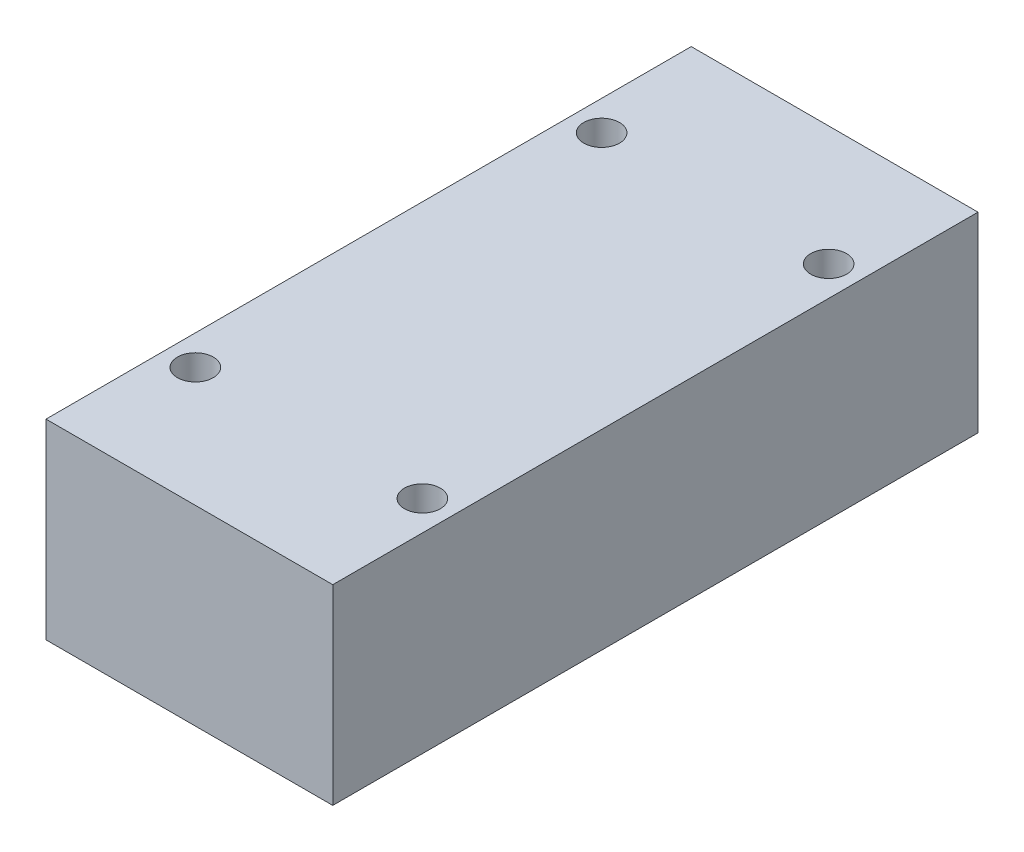
ISO-10303-21;
HEADER;
FILE_DESCRIPTION(('STEP AP214'),'2;1');
FILE_NAME('part.step','',(''),(''),'','','');
FILE_SCHEMA(('AUTOMOTIVE_DESIGN { 1 0 10303 214 1 1 1 1 }'));
ENDSEC;
DATA;
#1=APPLICATION_CONTEXT('core data for automotive mechanical design processes');
#2=APPLICATION_PROTOCOL_DEFINITION('international standard','automotive_design',2000,#1);
#3=PRODUCT_CONTEXT('',#1,'mechanical');
#4=PRODUCT('Part','Part','',(#3));
#5=PRODUCT_RELATED_PRODUCT_CATEGORY('part','',(#4));
#6=PRODUCT_DEFINITION_FORMATION('','',#4);
#7=PRODUCT_DEFINITION_CONTEXT('part definition',#1,'design');
#8=PRODUCT_DEFINITION('design','',#6,#7);
#9=PRODUCT_DEFINITION_SHAPE('','',#8);
#10=(LENGTH_UNIT() NAMED_UNIT(*) SI_UNIT(.MILLI.,.METRE.));
#11=(NAMED_UNIT(*) PLANE_ANGLE_UNIT() SI_UNIT($,.RADIAN.));
#12=(NAMED_UNIT(*) SI_UNIT($,.STERADIAN.) SOLID_ANGLE_UNIT());
#13=UNCERTAINTY_MEASURE_WITH_UNIT(LENGTH_MEASURE(1.E-05),#10,'distance_accuracy_value','');
#14=(GEOMETRIC_REPRESENTATION_CONTEXT(3) GLOBAL_UNCERTAINTY_ASSIGNED_CONTEXT((#13)) GLOBAL_UNIT_ASSIGNED_CONTEXT((#10,
#11,#12)) REPRESENTATION_CONTEXT('',''));
#15=CARTESIAN_POINT('',(0.,0.,0.));
#16=DIRECTION('',(0.,0.,1.));
#17=DIRECTION('',(1.,0.,0.));
#18=AXIS2_PLACEMENT_3D('',#15,#16,#17);
#19=CARTESIAN_POINT('',(-12.,7.99999999999999,27.));
#20=DIRECTION('',(1.,0.,0.));
#21=DIRECTION('',(0.,1.,0.));
#22=AXIS2_PLACEMENT_3D('',#19,#20,#21);
#23=PLANE('',#22);
#24=DIRECTION('',(0.,-1.,0.));
#25=VECTOR('',#24,1.);
#26=CARTESIAN_POINT('',(-12.,7.99999999999999,-27.));
#27=LINE('',#26,#25);
#28=CARTESIAN_POINT('',(-12.,7.99999999999999,-27.));
#29=VERTEX_POINT('',#28);
#30=CARTESIAN_POINT('',(-12.,-8.,-27.));
#31=VERTEX_POINT('',#30);
#32=EDGE_CURVE('E99',#29,#31,#27,.T.);
#33=ORIENTED_EDGE('',*,*,#32,.T.);
#34=DIRECTION('',(0.,0.,-1.));
#35=VECTOR('',#34,1.);
#36=CARTESIAN_POINT('',(-12.,-8.,27.));
#37=LINE('',#36,#35);
#38=CARTESIAN_POINT('',(-12.,-8.,27.));
#39=VERTEX_POINT('',#38);
#40=EDGE_CURVE('E11',#39,#31,#37,.T.);
#41=ORIENTED_EDGE('',*,*,#40,.F.);
#42=DIRECTION('',(0.,-1.,0.));
#43=VECTOR('',#42,1.);
#44=CARTESIAN_POINT('',(-12.,7.99999999999999,27.));
#45=LINE('',#44,#43);
#46=CARTESIAN_POINT('',(-12.,7.99999999999999,27.));
#47=VERTEX_POINT('',#46);
#48=EDGE_CURVE('E87',#47,#39,#45,.T.);
#49=ORIENTED_EDGE('',*,*,#48,.F.);
#50=DIRECTION('',(0.,0.,-1.));
#51=VECTOR('',#50,1.);
#52=CARTESIAN_POINT('',(-12.,7.99999999999999,27.));
#53=LINE('',#52,#51);
#54=EDGE_CURVE('E95',#47,#29,#53,.T.);
#55=ORIENTED_EDGE('',*,*,#54,.T.);
#56=EDGE_LOOP('',(#33,#41,#49,#55));
#57=FACE_BOUND('',#56,.T.);
#58=ADVANCED_FACE('F36',(#57),#23,.F.);
#59=CARTESIAN_POINT('',(12.,-7.99999999999999,27.));
#60=DIRECTION('',(0.,1.,0.));
#61=DIRECTION('',(-1.,0.,0.));
#62=AXIS2_PLACEMENT_3D('',#59,#60,#61);
#63=PLANE('',#62);
#64=CARTESIAN_POINT('',(-9.5,-8.,17.));
#65=DIRECTION('',(0.,1.,0.));
#66=DIRECTION('',(1.,0.,0.));
#67=AXIS2_PLACEMENT_3D('',#64,#65,#66);
#68=CIRCLE('',#67,1.5);
#69=CARTESIAN_POINT('',(-8.,-8.,17.));
#70=VERTEX_POINT('',#69);
#71=EDGE_CURVE('E122',#70,#70,#68,.T.);
#72=ORIENTED_EDGE('',*,*,#71,.T.);
#73=EDGE_LOOP('',(#72));
#74=FACE_BOUND('',#73,.T.);
#75=CARTESIAN_POINT('',(9.50000000000001,-8.,17.));
#76=DIRECTION('',(0.,1.,0.));
#77=DIRECTION('',(-1.,0.,0.));
#78=AXIS2_PLACEMENT_3D('',#75,#76,#77);
#79=CIRCLE('',#78,1.5);
#80=CARTESIAN_POINT('',(8.,-8.,17.));
#81=VERTEX_POINT('',#80);
#82=EDGE_CURVE('E128',#81,#81,#79,.T.);
#83=ORIENTED_EDGE('',*,*,#82,.T.);
#84=EDGE_LOOP('',(#83));
#85=FACE_BOUND('',#84,.T.);
#86=CARTESIAN_POINT('',(9.50000000000001,-8.,-17.));
#87=DIRECTION('',(0.,1.,0.));
#88=DIRECTION('',(1.,0.,0.));
#89=AXIS2_PLACEMENT_3D('',#86,#87,#88);
#90=CIRCLE('',#89,1.5);
#91=CARTESIAN_POINT('',(11.,-8.,-17.));
#92=VERTEX_POINT('',#91);
#93=EDGE_CURVE('E116',#92,#92,#90,.T.);
#94=ORIENTED_EDGE('',*,*,#93,.T.);
#95=EDGE_LOOP('',(#94));
#96=FACE_BOUND('',#95,.T.);
#97=CARTESIAN_POINT('',(-9.5,-8.,-17.));
#98=DIRECTION('',(0.,1.,0.));
#99=DIRECTION('',(-1.,0.,0.));
#100=AXIS2_PLACEMENT_3D('',#97,#98,#99);
#101=CIRCLE('',#100,1.5);
#102=CARTESIAN_POINT('',(-11.,-8.,-17.));
#103=VERTEX_POINT('',#102);
#104=EDGE_CURVE('E102',#103,#103,#101,.T.);
#105=ORIENTED_EDGE('',*,*,#104,.T.);
#106=EDGE_LOOP('',(#105));
#107=FACE_BOUND('',#106,.T.);
#108=DIRECTION('',(1.,0.,0.));
#109=VECTOR('',#108,1.);
#110=CARTESIAN_POINT('',(12.,-7.99999999999999,-27.));
#111=LINE('',#110,#109);
#112=CARTESIAN_POINT('',(12.,-7.99999999999999,-27.));
#113=VERTEX_POINT('',#112);
#114=EDGE_CURVE('E91',#31,#113,#111,.T.);
#115=ORIENTED_EDGE('',*,*,#114,.T.);
#116=DIRECTION('',(0.,0.,-1.));
#117=VECTOR('',#116,1.);
#118=CARTESIAN_POINT('',(12.,-7.99999999999999,27.));
#119=LINE('',#118,#117);
#120=CARTESIAN_POINT('',(12.,-7.99999999999999,27.));
#121=VERTEX_POINT('',#120);
#122=EDGE_CURVE('E44',#121,#113,#119,.T.);
#123=ORIENTED_EDGE('',*,*,#122,.F.);
#124=DIRECTION('',(1.,0.,0.));
#125=VECTOR('',#124,1.);
#126=CARTESIAN_POINT('',(12.,-7.99999999999999,27.));
#127=LINE('',#126,#125);
#128=EDGE_CURVE('E82',#39,#121,#127,.T.);
#129=ORIENTED_EDGE('',*,*,#128,.F.);
#130=ORIENTED_EDGE('',*,*,#40,.T.);
#131=EDGE_LOOP('',(#115,#123,#129,#130));
#132=FACE_BOUND('',#131,.T.);
#133=ADVANCED_FACE('F90',(#74,#85,#96,#107,#132),#63,.F.);
#134=CARTESIAN_POINT('',(12.,7.99999999999999,27.));
#135=DIRECTION('',(-1.,0.,0.));
#136=DIRECTION('',(0.,0.,1.));
#137=AXIS2_PLACEMENT_3D('',#134,#135,#136);
#138=PLANE('',#137);
#139=DIRECTION('',(0.,1.,0.));
#140=VECTOR('',#139,1.);
#141=CARTESIAN_POINT('',(12.,7.99999999999999,-27.));
#142=LINE('',#141,#140);
#143=CARTESIAN_POINT('',(12.,7.99999999999999,-27.));
#144=VERTEX_POINT('',#143);
#145=EDGE_CURVE('E69',#113,#144,#142,.T.);
#146=ORIENTED_EDGE('',*,*,#145,.T.);
#147=DIRECTION('',(0.,0.,-1.));
#148=VECTOR('',#147,1.);
#149=CARTESIAN_POINT('',(12.,7.99999999999999,27.));
#150=LINE('',#149,#148);
#151=CARTESIAN_POINT('',(12.,7.99999999999999,27.));
#152=VERTEX_POINT('',#151);
#153=EDGE_CURVE('E92',#152,#144,#150,.T.);
#154=ORIENTED_EDGE('',*,*,#153,.F.);
#155=DIRECTION('',(0.,1.,0.));
#156=VECTOR('',#155,1.);
#157=CARTESIAN_POINT('',(12.,7.99999999999999,27.));
#158=LINE('',#157,#156);
#159=EDGE_CURVE('E85',#121,#152,#158,.T.);
#160=ORIENTED_EDGE('',*,*,#159,.F.);
#161=ORIENTED_EDGE('',*,*,#122,.T.);
#162=EDGE_LOOP('',(#146,#154,#160,#161));
#163=FACE_BOUND('',#162,.T.);
#164=ADVANCED_FACE('F93',(#163),#138,.F.);
#165=CARTESIAN_POINT('',(12.,7.99999999999999,27.));
#166=DIRECTION('',(0.,-1.,0.));
#167=DIRECTION('',(1.,0.,0.));
#168=AXIS2_PLACEMENT_3D('',#165,#166,#167);
#169=PLANE('',#168);
#170=CARTESIAN_POINT('',(-9.5,7.99999999999999,17.));
#171=DIRECTION('',(0.,1.,0.));
#172=DIRECTION('',(1.,0.,0.));
#173=AXIS2_PLACEMENT_3D('',#170,#171,#172);
#174=CIRCLE('',#173,1.5);
#175=CARTESIAN_POINT('',(-8.,7.99999999999999,17.));
#176=VERTEX_POINT('',#175);
#177=EDGE_CURVE('E119',#176,#176,#174,.T.);
#178=ORIENTED_EDGE('',*,*,#177,.F.);
#179=EDGE_LOOP('',(#178));
#180=FACE_BOUND('',#179,.T.);
#181=CARTESIAN_POINT('',(9.5,7.99999999999999,17.));
#182=DIRECTION('',(0.,1.,0.));
#183=DIRECTION('',(-1.,0.,0.));
#184=AXIS2_PLACEMENT_3D('',#181,#182,#183);
#185=CIRCLE('',#184,1.5);
#186=CARTESIAN_POINT('',(8.,7.99999999999999,17.));
#187=VERTEX_POINT('',#186);
#188=EDGE_CURVE('E125',#187,#187,#185,.T.);
#189=ORIENTED_EDGE('',*,*,#188,.F.);
#190=EDGE_LOOP('',(#189));
#191=FACE_BOUND('',#190,.T.);
#192=CARTESIAN_POINT('',(9.5,7.99999999999999,-17.));
#193=DIRECTION('',(0.,1.,0.));
#194=DIRECTION('',(1.,0.,0.));
#195=AXIS2_PLACEMENT_3D('',#192,#193,#194);
#196=CIRCLE('',#195,1.5);
#197=CARTESIAN_POINT('',(11.,7.99999999999999,-17.));
#198=VERTEX_POINT('',#197);
#199=EDGE_CURVE('E131',#198,#198,#196,.T.);
#200=ORIENTED_EDGE('',*,*,#199,.F.);
#201=EDGE_LOOP('',(#200));
#202=FACE_BOUND('',#201,.T.);
#203=CARTESIAN_POINT('',(-9.5,7.99999999999999,-17.));
#204=DIRECTION('',(0.,1.,0.));
#205=DIRECTION('',(-1.,0.,0.));
#206=AXIS2_PLACEMENT_3D('',#203,#204,#205);
#207=CIRCLE('',#206,1.5);
#208=CARTESIAN_POINT('',(-11.,7.99999999999999,-17.));
#209=VERTEX_POINT('',#208);
#210=EDGE_CURVE('E113',#209,#209,#207,.T.);
#211=ORIENTED_EDGE('',*,*,#210,.F.);
#212=EDGE_LOOP('',(#211));
#213=FACE_BOUND('',#212,.T.);
#214=DIRECTION('',(-1.,0.,0.));
#215=VECTOR('',#214,1.);
#216=CARTESIAN_POINT('',(12.,7.99999999999999,-27.));
#217=LINE('',#216,#215);
#218=EDGE_CURVE('E75',#144,#29,#217,.T.);
#219=ORIENTED_EDGE('',*,*,#218,.T.);
#220=ORIENTED_EDGE('',*,*,#54,.F.);
#221=DIRECTION('',(-1.,0.,0.));
#222=VECTOR('',#221,1.);
#223=CARTESIAN_POINT('',(12.,7.99999999999999,27.));
#224=LINE('',#223,#222);
#225=EDGE_CURVE('E52',#152,#47,#224,.T.);
#226=ORIENTED_EDGE('',*,*,#225,.F.);
#227=ORIENTED_EDGE('',*,*,#153,.T.);
#228=EDGE_LOOP('',(#219,#220,#226,#227));
#229=FACE_BOUND('',#228,.T.);
#230=ADVANCED_FACE('F107',(#180,#191,#202,#213,#229),#169,.F.);
#231=CARTESIAN_POINT('',(0.,0.,27.));
#232=DIRECTION('',(0.,0.,-1.));
#233=DIRECTION('',(-1.,0.,0.));
#234=AXIS2_PLACEMENT_3D('',#231,#232,#233);
#235=PLANE('',#234);
#236=ORIENTED_EDGE('',*,*,#48,.T.);
#237=ORIENTED_EDGE('',*,*,#128,.T.);
#238=ORIENTED_EDGE('',*,*,#159,.T.);
#239=ORIENTED_EDGE('',*,*,#225,.T.);
#240=EDGE_LOOP('',(#236,#237,#238,#239));
#241=FACE_BOUND('',#240,.T.);
#242=ADVANCED_FACE('F83',(#241),#235,.F.);
#243=CARTESIAN_POINT('',(0.,0.,-27.));
#244=DIRECTION('',(0.,0.,-1.));
#245=DIRECTION('',(-1.,0.,0.));
#246=AXIS2_PLACEMENT_3D('',#243,#244,#245);
#247=PLANE('',#246);
#248=ORIENTED_EDGE('',*,*,#32,.F.);
#249=ORIENTED_EDGE('',*,*,#218,.F.);
#250=ORIENTED_EDGE('',*,*,#145,.F.);
#251=ORIENTED_EDGE('',*,*,#114,.F.);
#252=EDGE_LOOP('',(#248,#249,#250,#251));
#253=FACE_BOUND('',#252,.T.);
#254=ADVANCED_FACE('F110',(#253),#247,.T.);
#255=CARTESIAN_POINT('',(-9.5,-8.,-17.));
#256=DIRECTION('',(0.,1.,0.));
#257=DIRECTION('',(-1.,0.,0.));
#258=AXIS2_PLACEMENT_3D('',#255,#256,#257);
#259=CYLINDRICAL_SURFACE('',#258,1.5);
#260=ORIENTED_EDGE('',*,*,#104,.F.);
#261=EDGE_LOOP('',(#260));
#262=FACE_BOUND('',#261,.T.);
#263=ORIENTED_EDGE('',*,*,#210,.T.);
#264=EDGE_LOOP('',(#263));
#265=FACE_BOUND('',#264,.T.);
#266=ADVANCED_FACE('F143',(#262,#265),#259,.F.);
#267=CARTESIAN_POINT('',(9.50000000000001,-8.,-17.));
#268=DIRECTION('',(0.,1.,0.));
#269=DIRECTION('',(-1.,0.,0.));
#270=AXIS2_PLACEMENT_3D('',#267,#268,#269);
#271=CYLINDRICAL_SURFACE('',#270,1.5);
#272=ORIENTED_EDGE('',*,*,#93,.F.);
#273=EDGE_LOOP('',(#272));
#274=FACE_BOUND('',#273,.T.);
#275=ORIENTED_EDGE('',*,*,#199,.T.);
#276=EDGE_LOOP('',(#275));
#277=FACE_BOUND('',#276,.T.);
#278=ADVANCED_FACE('F139',(#274,#277),#271,.F.);
#279=CARTESIAN_POINT('',(9.50000000000001,-8.,17.));
#280=DIRECTION('',(0.,1.,0.));
#281=DIRECTION('',(-1.,0.,0.));
#282=AXIS2_PLACEMENT_3D('',#279,#280,#281);
#283=CYLINDRICAL_SURFACE('',#282,1.5);
#284=ORIENTED_EDGE('',*,*,#82,.F.);
#285=EDGE_LOOP('',(#284));
#286=FACE_BOUND('',#285,.T.);
#287=ORIENTED_EDGE('',*,*,#188,.T.);
#288=EDGE_LOOP('',(#287));
#289=FACE_BOUND('',#288,.T.);
#290=ADVANCED_FACE('F142',(#286,#289),#283,.F.);
#291=CARTESIAN_POINT('',(-9.5,-8.,17.));
#292=DIRECTION('',(0.,1.,0.));
#293=DIRECTION('',(-1.,0.,0.));
#294=AXIS2_PLACEMENT_3D('',#291,#292,#293);
#295=CYLINDRICAL_SURFACE('',#294,1.5);
#296=ORIENTED_EDGE('',*,*,#71,.F.);
#297=EDGE_LOOP('',(#296));
#298=FACE_BOUND('',#297,.T.);
#299=ORIENTED_EDGE('',*,*,#177,.T.);
#300=EDGE_LOOP('',(#299));
#301=FACE_BOUND('',#300,.T.);
#302=ADVANCED_FACE('F212',(#298,#301),#295,.F.);
#303=CLOSED_SHELL('',(#58,#133,#164,#230,#242,#254,#266,#278,#290,#302));
#304=MANIFOLD_SOLID_BREP('B2',#303);
#305=ADVANCED_BREP_SHAPE_REPRESENTATION('',(#18,#304),#14);
#306=SHAPE_DEFINITION_REPRESENTATION(#9,#305);
ENDSEC;
END-ISO-10303-21;
